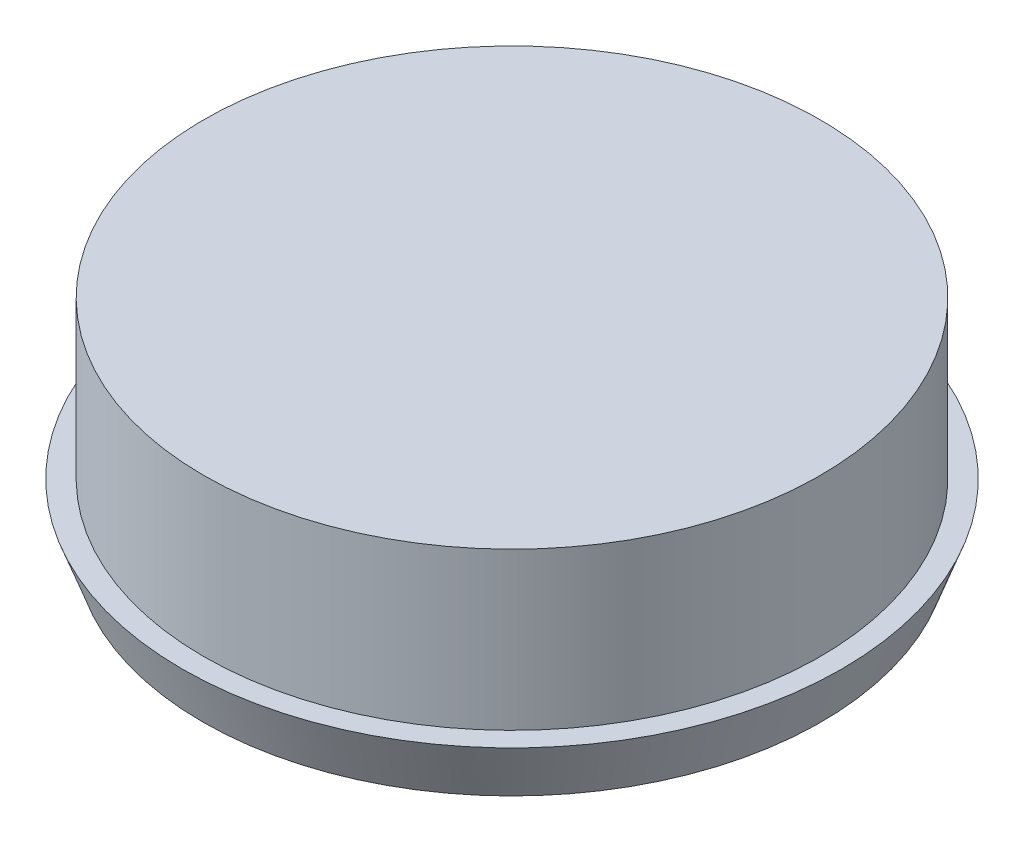
ISO-10303-21;
HEADER;
FILE_DESCRIPTION(('STEP AP214'),'2;1');
FILE_NAME('part.step','',(''),(''),'','','');
FILE_SCHEMA(('AUTOMOTIVE_DESIGN { 1 0 10303 214 1 1 1 1 }'));
ENDSEC;
DATA;
#1=APPLICATION_CONTEXT('core data for automotive mechanical design processes');
#2=APPLICATION_PROTOCOL_DEFINITION('international standard','automotive_design',2000,#1);
#3=PRODUCT_CONTEXT('',#1,'mechanical');
#4=PRODUCT('Part','Part','',(#3));
#5=PRODUCT_RELATED_PRODUCT_CATEGORY('part','',(#4));
#6=PRODUCT_DEFINITION_FORMATION('','',#4);
#7=PRODUCT_DEFINITION_CONTEXT('part definition',#1,'design');
#8=PRODUCT_DEFINITION('design','',#6,#7);
#9=PRODUCT_DEFINITION_SHAPE('','',#8);
#10=(LENGTH_UNIT() NAMED_UNIT(*) SI_UNIT(.MILLI.,.METRE.));
#11=(NAMED_UNIT(*) PLANE_ANGLE_UNIT() SI_UNIT($,.RADIAN.));
#12=(NAMED_UNIT(*) SI_UNIT($,.STERADIAN.) SOLID_ANGLE_UNIT());
#13=UNCERTAINTY_MEASURE_WITH_UNIT(LENGTH_MEASURE(1.E-05),#10,'distance_accuracy_value','');
#14=(GEOMETRIC_REPRESENTATION_CONTEXT(3) GLOBAL_UNCERTAINTY_ASSIGNED_CONTEXT((#13)) GLOBAL_UNIT_ASSIGNED_CONTEXT((#10,
#11,#12)) REPRESENTATION_CONTEXT('',''));
#15=CARTESIAN_POINT('',(0.,0.,0.));
#16=DIRECTION('',(0.,0.,1.));
#17=DIRECTION('',(1.,0.,0.));
#18=AXIS2_PLACEMENT_3D('',#15,#16,#17);
#19=CARTESIAN_POINT('',(0.,5.,0.));
#20=DIRECTION('',(0.,1.,0.));
#21=DIRECTION('',(0.,0.,1.));
#22=AXIS2_PLACEMENT_3D('',#19,#20,#21);
#23=PLANE('',#22);
#24=CARTESIAN_POINT('',(0.,5.,0.));
#25=DIRECTION('',(0.,1.,0.));
#26=DIRECTION('',(0.,0.,1.));
#27=AXIS2_PLACEMENT_3D('',#24,#25,#26);
#28=CIRCLE('',#27,29.419851171331);
#29=CARTESIAN_POINT('',(0.,5.,29.419851171331));
#30=VERTEX_POINT('',#29);
#31=EDGE_CURVE('E53',#30,#30,#28,.T.);
#32=ORIENTED_EDGE('',*,*,#31,.T.);
#33=EDGE_LOOP('',(#32));
#34=FACE_BOUND('',#33,.T.);
#35=CARTESIAN_POINT('',(0.,5.,0.));
#36=DIRECTION('',(0.,1.,0.));
#37=DIRECTION('',(0.,0.,1.));
#38=AXIS2_PLACEMENT_3D('',#35,#36,#37);
#39=CIRCLE('',#38,27.5);
#40=CARTESIAN_POINT('',(0.,5.,27.5));
#41=VERTEX_POINT('',#40);
#42=EDGE_CURVE('E56',#41,#41,#39,.T.);
#43=ORIENTED_EDGE('',*,*,#42,.F.);
#44=EDGE_LOOP('',(#43));
#45=FACE_BOUND('',#44,.T.);
#46=ADVANCED_FACE('F33',(#34,#45),#23,.T.);
#47=CARTESIAN_POINT('',(0.,0.,0.));
#48=DIRECTION('',(0.,1.,0.));
#49=DIRECTION('',(0.,0.,1.));
#50=AXIS2_PLACEMENT_3D('',#47,#48,#49);
#51=PLANE('',#50);
#52=CARTESIAN_POINT('',(0.,0.,0.));
#53=DIRECTION('',(0.,1.,0.));
#54=DIRECTION('',(0.,0.,1.));
#55=AXIS2_PLACEMENT_3D('',#52,#53,#54);
#56=CIRCLE('',#55,3.);
#57=CARTESIAN_POINT('',(0.,0.,3.));
#58=VERTEX_POINT('',#57);
#59=EDGE_CURVE('E44',#58,#58,#56,.F.);
#60=ORIENTED_EDGE('',*,*,#59,.F.);
#61=EDGE_LOOP('',(#60));
#62=FACE_BOUND('',#61,.T.);
#63=CARTESIAN_POINT('',(0.,0.,12.5));
#64=DIRECTION('',(0.,-1.,0.));
#65=DIRECTION('',(0.,0.,-1.));
#66=AXIS2_PLACEMENT_3D('',#63,#64,#65);
#67=CIRCLE('',#66,1.5);
#68=CARTESIAN_POINT('',(0.,0.,11.));
#69=VERTEX_POINT('',#68);
#70=EDGE_CURVE('E81',#69,#69,#67,.T.);
#71=ORIENTED_EDGE('',*,*,#70,.F.);
#72=EDGE_LOOP('',(#71));
#73=FACE_BOUND('',#72,.T.);
#74=CARTESIAN_POINT('',(12.5,0.,0.));
#75=DIRECTION('',(0.,-1.,0.));
#76=DIRECTION('',(0.,0.,-1.));
#77=AXIS2_PLACEMENT_3D('',#74,#75,#76);
#78=CIRCLE('',#77,1.5);
#79=CARTESIAN_POINT('',(12.5,0.,-1.5));
#80=VERTEX_POINT('',#79);
#81=EDGE_CURVE('E75',#80,#80,#78,.T.);
#82=ORIENTED_EDGE('',*,*,#81,.F.);
#83=EDGE_LOOP('',(#82));
#84=FACE_BOUND('',#83,.T.);
#85=CARTESIAN_POINT('',(0.,0.,-12.5));
#86=DIRECTION('',(0.,-1.,0.));
#87=DIRECTION('',(0.,0.,-1.));
#88=AXIS2_PLACEMENT_3D('',#85,#86,#87);
#89=CIRCLE('',#88,1.5);
#90=CARTESIAN_POINT('',(0.,0.,-14.));
#91=VERTEX_POINT('',#90);
#92=EDGE_CURVE('E69',#91,#91,#89,.T.);
#93=ORIENTED_EDGE('',*,*,#92,.F.);
#94=EDGE_LOOP('',(#93));
#95=FACE_BOUND('',#94,.T.);
#96=CARTESIAN_POINT('',(-12.5,0.,0.));
#97=DIRECTION('',(0.,-1.,0.));
#98=DIRECTION('',(0.,0.,-1.));
#99=AXIS2_PLACEMENT_3D('',#96,#97,#98);
#100=CIRCLE('',#99,1.5);
#101=CARTESIAN_POINT('',(-12.5,0.,-1.5));
#102=VERTEX_POINT('',#101);
#103=EDGE_CURVE('E63',#102,#102,#100,.T.);
#104=ORIENTED_EDGE('',*,*,#103,.F.);
#105=EDGE_LOOP('',(#104));
#106=FACE_BOUND('',#105,.T.);
#107=CARTESIAN_POINT('',(0.,0.,0.));
#108=DIRECTION('',(0.,1.,0.));
#109=DIRECTION('',(0.,0.,1.));
#110=AXIS2_PLACEMENT_3D('',#107,#108,#109);
#111=CIRCLE('',#110,27.6);
#112=CARTESIAN_POINT('',(0.,0.,27.6));
#113=VERTEX_POINT('',#112);
#114=EDGE_CURVE('E48',#113,#113,#111,.F.);
#115=ORIENTED_EDGE('',*,*,#114,.T.);
#116=EDGE_LOOP('',(#115));
#117=FACE_BOUND('',#116,.T.);
#118=ADVANCED_FACE('F96',(#62,#73,#84,#95,#106,#117),#51,.F.);
#119=CARTESIAN_POINT('',(0.,19.,0.));
#120=DIRECTION('',(0.,-1.,0.));
#121=DIRECTION('',(0.,0.,-1.));
#122=AXIS2_PLACEMENT_3D('',#119,#120,#121);
#123=CYLINDRICAL_SURFACE('',#122,27.5);
#124=CARTESIAN_POINT('',(0.,19.,0.));
#125=DIRECTION('',(0.,1.,0.));
#126=DIRECTION('',(0.,0.,1.));
#127=AXIS2_PLACEMENT_3D('',#124,#125,#126);
#128=CIRCLE('',#127,27.5);
#129=CARTESIAN_POINT('',(0.,19.,27.5));
#130=VERTEX_POINT('',#129);
#131=EDGE_CURVE('E59',#130,#130,#128,.T.);
#132=ORIENTED_EDGE('',*,*,#131,.F.);
#133=EDGE_LOOP('',(#132));
#134=FACE_BOUND('',#133,.T.);
#135=ORIENTED_EDGE('',*,*,#42,.T.);
#136=EDGE_LOOP('',(#135));
#137=FACE_BOUND('',#136,.T.);
#138=ADVANCED_FACE('F99',(#134,#137),#123,.T.);
#139=CARTESIAN_POINT('',(0.,19.,0.));
#140=DIRECTION('',(0.,1.,0.));
#141=DIRECTION('',(0.,0.,1.));
#142=AXIS2_PLACEMENT_3D('',#139,#140,#141);
#143=PLANE('',#142);
#144=ORIENTED_EDGE('',*,*,#131,.T.);
#145=EDGE_LOOP('',(#144));
#146=FACE_BOUND('',#145,.T.);
#147=ADVANCED_FACE('F114',(#146),#143,.T.);
#148=CARTESIAN_POINT('',(0.,5.22020709696395,0.));
#149=DIRECTION('',(0.,1.,0.));
#150=DIRECTION('',(0.,0.,1.));
#151=AXIS2_PLACEMENT_3D('',#148,#149,#150);
#152=CONICAL_SURFACE('',#151,29.5,0.349065850398862);
#153=ORIENTED_EDGE('',*,*,#114,.F.);
#154=EDGE_LOOP('',(#153));
#155=FACE_BOUND('',#154,.T.);
#156=ORIENTED_EDGE('',*,*,#31,.F.);
#157=EDGE_LOOP('',(#156));
#158=FACE_BOUND('',#157,.T.);
#159=ADVANCED_FACE('F110',(#155,#158),#152,.T.);
#160=CARTESIAN_POINT('',(-12.5,3.5,0.));
#161=DIRECTION('',(0.,-1.,0.));
#162=DIRECTION('',(0.,0.,-1.));
#163=AXIS2_PLACEMENT_3D('',#160,#161,#162);
#164=CYLINDRICAL_SURFACE('',#163,1.5);
#165=CARTESIAN_POINT('',(-12.5,3.5,0.));
#166=DIRECTION('',(0.,-1.,0.));
#167=DIRECTION('',(0.,0.,-1.));
#168=AXIS2_PLACEMENT_3D('',#165,#166,#167);
#169=CIRCLE('',#168,1.5);
#170=CARTESIAN_POINT('',(-12.5,3.5,-1.5));
#171=VERTEX_POINT('',#170);
#172=EDGE_CURVE('E66',#171,#171,#169,.T.);
#173=ORIENTED_EDGE('',*,*,#172,.F.);
#174=EDGE_LOOP('',(#173));
#175=FACE_BOUND('',#174,.T.);
#176=ORIENTED_EDGE('',*,*,#103,.T.);
#177=EDGE_LOOP('',(#176));
#178=FACE_BOUND('',#177,.T.);
#179=ADVANCED_FACE('F113',(#175,#178),#164,.F.);
#180=CARTESIAN_POINT('',(-12.5,3.5,0.));
#181=DIRECTION('',(0.,-1.,0.));
#182=DIRECTION('',(0.,0.,-1.));
#183=AXIS2_PLACEMENT_3D('',#180,#181,#182);
#184=PLANE('',#183);
#185=ORIENTED_EDGE('',*,*,#172,.T.);
#186=EDGE_LOOP('',(#185));
#187=FACE_BOUND('',#186,.T.);
#188=ADVANCED_FACE('F134',(#187),#184,.T.);
#189=CARTESIAN_POINT('',(0.,3.5,-12.5));
#190=DIRECTION('',(0.,-1.,0.));
#191=DIRECTION('',(0.,0.,-1.));
#192=AXIS2_PLACEMENT_3D('',#189,#190,#191);
#193=CYLINDRICAL_SURFACE('',#192,1.5);
#194=CARTESIAN_POINT('',(0.,3.5,-12.5));
#195=DIRECTION('',(0.,-1.,0.));
#196=DIRECTION('',(0.,0.,-1.));
#197=AXIS2_PLACEMENT_3D('',#194,#195,#196);
#198=CIRCLE('',#197,1.5);
#199=CARTESIAN_POINT('',(0.,3.5,-14.));
#200=VERTEX_POINT('',#199);
#201=EDGE_CURVE('E72',#200,#200,#198,.T.);
#202=ORIENTED_EDGE('',*,*,#201,.F.);
#203=EDGE_LOOP('',(#202));
#204=FACE_BOUND('',#203,.T.);
#205=ORIENTED_EDGE('',*,*,#92,.T.);
#206=EDGE_LOOP('',(#205));
#207=FACE_BOUND('',#206,.T.);
#208=ADVANCED_FACE('F138',(#204,#207),#193,.F.);
#209=CARTESIAN_POINT('',(0.,3.5,-12.5));
#210=DIRECTION('',(0.,-1.,0.));
#211=DIRECTION('',(0.,0.,-1.));
#212=AXIS2_PLACEMENT_3D('',#209,#210,#211);
#213=PLANE('',#212);
#214=ORIENTED_EDGE('',*,*,#201,.T.);
#215=EDGE_LOOP('',(#214));
#216=FACE_BOUND('',#215,.T.);
#217=ADVANCED_FACE('F142',(#216),#213,.T.);
#218=CARTESIAN_POINT('',(12.5,3.5,0.));
#219=DIRECTION('',(0.,-1.,0.));
#220=DIRECTION('',(0.,0.,-1.));
#221=AXIS2_PLACEMENT_3D('',#218,#219,#220);
#222=CYLINDRICAL_SURFACE('',#221,1.5);
#223=CARTESIAN_POINT('',(12.5,3.5,0.));
#224=DIRECTION('',(0.,-1.,0.));
#225=DIRECTION('',(0.,0.,-1.));
#226=AXIS2_PLACEMENT_3D('',#223,#224,#225);
#227=CIRCLE('',#226,1.5);
#228=CARTESIAN_POINT('',(12.5,3.5,-1.5));
#229=VERTEX_POINT('',#228);
#230=EDGE_CURVE('E78',#229,#229,#227,.T.);
#231=ORIENTED_EDGE('',*,*,#230,.F.);
#232=EDGE_LOOP('',(#231));
#233=FACE_BOUND('',#232,.T.);
#234=ORIENTED_EDGE('',*,*,#81,.T.);
#235=EDGE_LOOP('',(#234));
#236=FACE_BOUND('',#235,.T.);
#237=ADVANCED_FACE('F146',(#233,#236),#222,.F.);
#238=CARTESIAN_POINT('',(12.5,3.5,0.));
#239=DIRECTION('',(0.,-1.,0.));
#240=DIRECTION('',(0.,0.,-1.));
#241=AXIS2_PLACEMENT_3D('',#238,#239,#240);
#242=PLANE('',#241);
#243=ORIENTED_EDGE('',*,*,#230,.T.);
#244=EDGE_LOOP('',(#243));
#245=FACE_BOUND('',#244,.T.);
#246=ADVANCED_FACE('F92',(#245),#242,.T.);
#247=CARTESIAN_POINT('',(0.,3.5,12.5));
#248=DIRECTION('',(0.,-1.,0.));
#249=DIRECTION('',(0.,0.,-1.));
#250=AXIS2_PLACEMENT_3D('',#247,#248,#249);
#251=CYLINDRICAL_SURFACE('',#250,1.5);
#252=CARTESIAN_POINT('',(0.,3.5,12.5));
#253=DIRECTION('',(0.,-1.,0.));
#254=DIRECTION('',(0.,0.,-1.));
#255=AXIS2_PLACEMENT_3D('',#252,#253,#254);
#256=CIRCLE('',#255,1.5);
#257=CARTESIAN_POINT('',(0.,3.5,11.));
#258=VERTEX_POINT('',#257);
#259=EDGE_CURVE('E62',#258,#258,#256,.T.);
#260=ORIENTED_EDGE('',*,*,#259,.F.);
#261=EDGE_LOOP('',(#260));
#262=FACE_BOUND('',#261,.T.);
#263=ORIENTED_EDGE('',*,*,#70,.T.);
#264=EDGE_LOOP('',(#263));
#265=FACE_BOUND('',#264,.T.);
#266=ADVANCED_FACE('F89',(#262,#265),#251,.F.);
#267=CARTESIAN_POINT('',(0.,3.5,12.5));
#268=DIRECTION('',(0.,-1.,0.));
#269=DIRECTION('',(0.,0.,-1.));
#270=AXIS2_PLACEMENT_3D('',#267,#268,#269);
#271=PLANE('',#270);
#272=ORIENTED_EDGE('',*,*,#259,.T.);
#273=EDGE_LOOP('',(#272));
#274=FACE_BOUND('',#273,.T.);
#275=ADVANCED_FACE('F87',(#274),#271,.T.);
#276=CARTESIAN_POINT('',(0.,-2.7,0.));
#277=DIRECTION('',(0.,1.,0.));
#278=DIRECTION('',(0.,0.,1.));
#279=AXIS2_PLACEMENT_3D('',#276,#277,#278);
#280=CYLINDRICAL_SURFACE('',#279,3.);
#281=CARTESIAN_POINT('',(0.,-2.50000000000006,0.));
#282=DIRECTION('',(0.,-1.,0.));
#283=DIRECTION('',(0.,0.,-1.));
#284=AXIS2_PLACEMENT_3D('',#281,#282,#283);
#285=CIRCLE('',#284,3.);
#286=CARTESIAN_POINT('',(0.,-2.50000000000006,3.));
#287=VERTEX_POINT('',#286);
#288=EDGE_CURVE('E10',#287,#287,#285,.F.);
#289=CARTESIAN_POINT('',(0.,-2.50000000000006,3.));
#290=CARTESIAN_POINT('',(0.,-2.4739583333334,3.));
#291=CARTESIAN_POINT('',(0.,-2.44791666666673,3.));
#292=CARTESIAN_POINT('',(0.,-2.39583333333339,3.));
#293=CARTESIAN_POINT('',(0.,-2.36979166666673,3.));
#294=CARTESIAN_POINT('',(0.,-2.31770833333339,3.));
#295=CARTESIAN_POINT('',(0.,-2.29166666666672,3.));
#296=CARTESIAN_POINT('',(0.,-2.23958333333339,3.));
#297=CARTESIAN_POINT('',(0.,-2.21354166666672,3.));
#298=CARTESIAN_POINT('',(0.,-2.16145833333339,3.));
#299=CARTESIAN_POINT('',(0.,-2.13541666666672,3.));
#300=CARTESIAN_POINT('',(0.,-2.08333333333339,3.));
#301=CARTESIAN_POINT('',(0.,-2.05729166666672,3.));
#302=CARTESIAN_POINT('',(0.,-2.00520833333338,3.));
#303=CARTESIAN_POINT('',(0.,-1.97916666666672,3.));
#304=CARTESIAN_POINT('',(0.,-1.92708333333338,3.));
#305=CARTESIAN_POINT('',(0.,-1.90104166666671,3.));
#306=CARTESIAN_POINT('',(0.,-1.84895833333338,3.));
#307=CARTESIAN_POINT('',(0.,-1.82291666666671,3.));
#308=CARTESIAN_POINT('',(0.,-1.77083333333338,3.));
#309=CARTESIAN_POINT('',(0.,-1.74479166666671,3.));
#310=CARTESIAN_POINT('',(0.,-1.69270833333338,3.));
#311=CARTESIAN_POINT('',(0.,-1.66666666666671,3.));
#312=CARTESIAN_POINT('',(0.,-1.61458333333337,3.));
#313=CARTESIAN_POINT('',(0.,-1.58854166666671,3.));
#314=CARTESIAN_POINT('',(0.,-1.53645833333337,3.));
#315=CARTESIAN_POINT('',(0.,-1.5104166666667,3.));
#316=CARTESIAN_POINT('',(0.,-1.45833333333337,3.));
#317=CARTESIAN_POINT('',(0.,-1.4322916666667,3.));
#318=CARTESIAN_POINT('',(0.,-1.38020833333337,3.));
#319=CARTESIAN_POINT('',(0.,-1.3541666666667,3.));
#320=CARTESIAN_POINT('',(0.,-1.30208333333337,3.));
#321=CARTESIAN_POINT('',(0.,-1.2760416666667,3.));
#322=CARTESIAN_POINT('',(0.,-1.22395833333336,3.));
#323=CARTESIAN_POINT('',(0.,-1.1979166666667,3.));
#324=CARTESIAN_POINT('',(0.,-1.14583333333336,3.));
#325=CARTESIAN_POINT('',(0.,-1.1197916666667,3.));
#326=CARTESIAN_POINT('',(0.,-1.06770833333336,3.));
#327=CARTESIAN_POINT('',(0.,-1.04166666666669,3.));
#328=CARTESIAN_POINT('',(0.,-0.989583333333359,3.));
#329=CARTESIAN_POINT('',(0.,-0.963541666666691,3.));
#330=CARTESIAN_POINT('',(0.,-0.911458333333357,3.));
#331=CARTESIAN_POINT('',(0.,-0.885416666666689,3.));
#332=CARTESIAN_POINT('',(0.,-0.833333333333355,3.));
#333=CARTESIAN_POINT('',(0.,-0.807291666666687,3.));
#334=CARTESIAN_POINT('',(0.,-0.755208333333353,3.));
#335=CARTESIAN_POINT('',(0.,-0.729166666666685,3.));
#336=CARTESIAN_POINT('',(0.,-0.677083333333351,3.));
#337=CARTESIAN_POINT('',(0.,-0.651041666666683,3.));
#338=CARTESIAN_POINT('',(0.,-0.598958333333349,3.));
#339=CARTESIAN_POINT('',(0.,-0.572916666666681,3.));
#340=CARTESIAN_POINT('',(0.,-0.520833333333347,3.));
#341=CARTESIAN_POINT('',(0.,-0.494791666666679,3.));
#342=CARTESIAN_POINT('',(0.,-0.442708333333345,3.));
#343=CARTESIAN_POINT('',(0.,-0.416666666666678,3.));
#344=CARTESIAN_POINT('',(0.,-0.364583333333343,3.));
#345=CARTESIAN_POINT('',(0.,-0.338541666666676,3.));
#346=CARTESIAN_POINT('',(0.,-0.286458333333341,3.));
#347=CARTESIAN_POINT('',(0.,-0.260416666666674,3.));
#348=CARTESIAN_POINT('',(0.,-0.208333333333339,3.));
#349=CARTESIAN_POINT('',(0.,-0.182291666666672,3.));
#350=CARTESIAN_POINT('',(0.,-0.130208333333337,3.));
#351=CARTESIAN_POINT('',(0.,-0.10416666666667,3.));
#352=CARTESIAN_POINT('',(0.,-0.052083333333335,3.));
#353=CARTESIAN_POINT('',(0.,-0.0260416666666677,3.));
#354=CARTESIAN_POINT('',(0.,0.,3.));
#355=B_SPLINE_CURVE_WITH_KNOTS('',3,(#289,#290,#291,#292,#293,#294,#295,#296,#297,#298,#299,
#300,#301,#302,#303,#304,#305,#306,#307,#308,#309,#310,#311,#312,#313,#314,#315,#316,#317,#318,
#319,#320,#321,#322,#323,#324,#325,#326,#327,#328,#329,#330,#331,#332,#333,#334,#335,#336,#337,
#338,#339,#340,#341,#342,#343,#344,#345,#346,#347,#348,#349,#350,#351,#352,#353,#354),
.UNSPECIFIED.,.F.,.F.,(4,2,2,2,2,2,2,2,2,2,2,2,2,2,2,2,2,2,2,2,2,2,2,2,2,2,2,2,2,2,2,2,4),(0.,
0.0781250000000018,0.156250000000004,0.234375000000006,0.312500000000008,0.390625000000009,
0.468750000000011,0.546875000000014,0.625000000000015,0.703125000000017,0.781250000000019,
0.859375000000021,0.937500000000023,1.01562500000002,1.09375000000003,1.17187500000003,
1.25000000000003,1.32812500000003,1.40625000000003,1.48437500000004,1.56250000000004,
1.64062500000004,1.71875000000004,1.79687500000004,1.87500000000005,1.95312500000005,
2.03125000000005,2.10937500000005,2.18750000000005,2.26562500000006,2.34375000000006,
2.42187500000006,2.50000000000006),.UNSPECIFIED.);
#356=EDGE_CURVE('BSEAM156',#287,#58,#355,.T.);
#357=ORIENTED_EDGE('',*,*,#288,.T.);
#358=ORIENTED_EDGE('',*,*,#59,.T.);
#359=ORIENTED_EDGE('',*,*,#356,.T.);
#360=ORIENTED_EDGE('',*,*,#356,.F.);
#361=EDGE_LOOP('',(#357,#359,#358,#360));
#362=FACE_BOUND('',#361,.T.);
#363=ADVANCED_FACE('F156',(#362),#280,.T.);
#364=CARTESIAN_POINT('',(0.,-2.7,0.));
#365=DIRECTION('',(0.,-1.,0.));
#366=DIRECTION('',(0.,0.,-1.));
#367=AXIS2_PLACEMENT_3D('',#364,#365,#366);
#368=PLANE('',#367);
#369=CARTESIAN_POINT('',(0.,-2.7,0.));
#370=DIRECTION('',(0.,-1.,0.));
#371=DIRECTION('',(0.,0.,-1.));
#372=AXIS2_PLACEMENT_3D('',#369,#370,#371);
#373=CIRCLE('',#372,2.80000000000005);
#374=CARTESIAN_POINT('',(0.,-2.7,-2.80000000000005));
#375=VERTEX_POINT('',#374);
#376=EDGE_CURVE('E40',#375,#375,#373,.T.);
#377=ORIENTED_EDGE('',*,*,#376,.T.);
#378=EDGE_LOOP('',(#377));
#379=FACE_BOUND('',#378,.T.);
#380=ADVANCED_FACE('F159',(#379),#368,.T.);
#381=CARTESIAN_POINT('',(0.,-2.7,0.));
#382=DIRECTION('',(0.,1.,0.));
#383=DIRECTION('',(0.,0.,1.));
#384=AXIS2_PLACEMENT_3D('',#381,#382,#383);
#385=CONICAL_SURFACE('',#384,2.80000000000005,0.785398163397476);
#386=ORIENTED_EDGE('',*,*,#288,.F.);
#387=EDGE_LOOP('',(#386));
#388=FACE_BOUND('',#387,.T.);
#389=ORIENTED_EDGE('',*,*,#376,.F.);
#390=EDGE_LOOP('',(#389));
#391=FACE_BOUND('',#390,.T.);
#392=ADVANCED_FACE('F35',(#388,#391),#385,.T.);
#393=CLOSED_SHELL('',(#46,#118,#138,#147,#159,#179,#188,#208,#217,#237,#246,#266,#275,#363,#380,#392));
#394=MANIFOLD_SOLID_BREP('B2',#393);
#395=ADVANCED_BREP_SHAPE_REPRESENTATION('',(#18,#394),#14);
#396=SHAPE_DEFINITION_REPRESENTATION(#9,#395);
ENDSEC;
END-ISO-10303-21;
